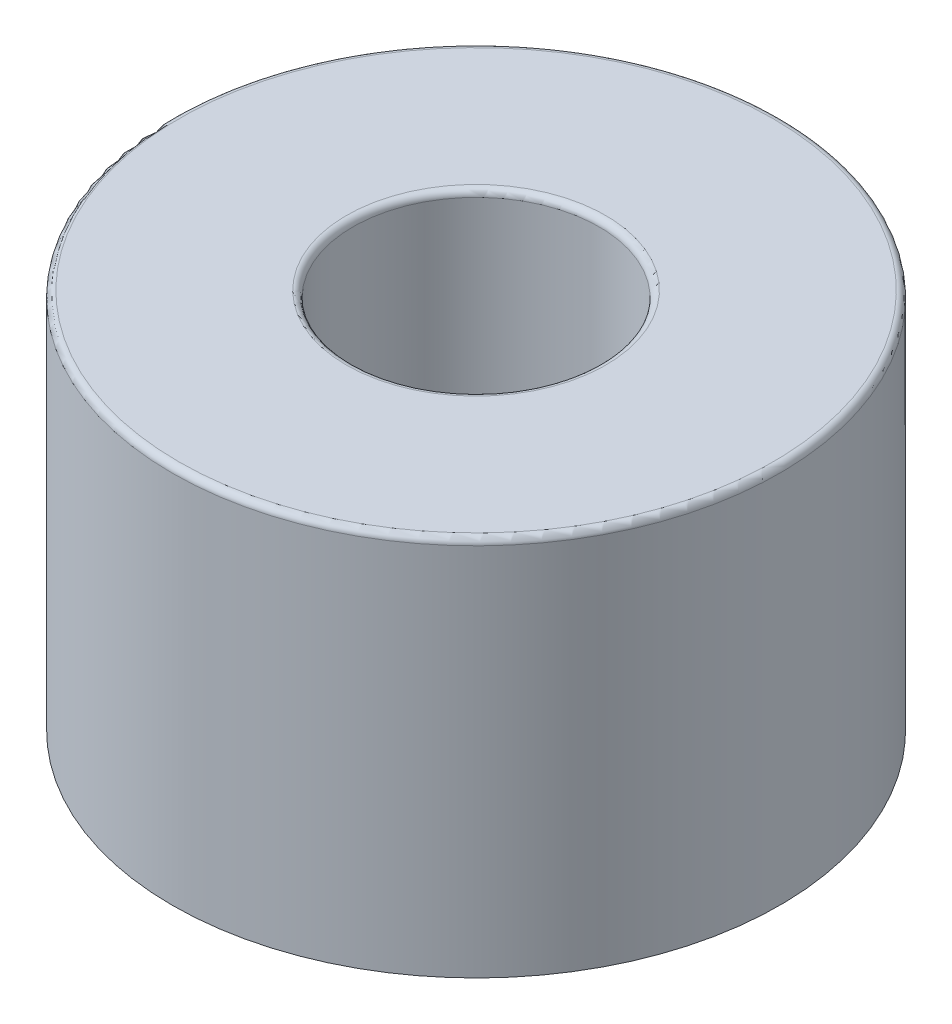
ISO-10303-21;
HEADER;
FILE_DESCRIPTION(('STEP AP214'),'2;1');
FILE_NAME('part.step','',(''),(''),'','','');
FILE_SCHEMA(('AUTOMOTIVE_DESIGN { 1 0 10303 214 1 1 1 1 }'));
ENDSEC;
DATA;
#1=APPLICATION_CONTEXT('core data for automotive mechanical design processes');
#2=APPLICATION_PROTOCOL_DEFINITION('international standard','automotive_design',2000,#1);
#3=PRODUCT_CONTEXT('',#1,'mechanical');
#4=PRODUCT('Part','Part','',(#3));
#5=PRODUCT_RELATED_PRODUCT_CATEGORY('part','',(#4));
#6=PRODUCT_DEFINITION_FORMATION('','',#4);
#7=PRODUCT_DEFINITION_CONTEXT('part definition',#1,'design');
#8=PRODUCT_DEFINITION('design','',#6,#7);
#9=PRODUCT_DEFINITION_SHAPE('','',#8);
#10=(LENGTH_UNIT() NAMED_UNIT(*) SI_UNIT(.MILLI.,.METRE.));
#11=(NAMED_UNIT(*) PLANE_ANGLE_UNIT() SI_UNIT($,.RADIAN.));
#12=(NAMED_UNIT(*) SI_UNIT($,.STERADIAN.) SOLID_ANGLE_UNIT());
#13=UNCERTAINTY_MEASURE_WITH_UNIT(LENGTH_MEASURE(1.E-05),#10,'distance_accuracy_value','');
#14=(GEOMETRIC_REPRESENTATION_CONTEXT(3) GLOBAL_UNCERTAINTY_ASSIGNED_CONTEXT((#13)) GLOBAL_UNIT_ASSIGNED_CONTEXT((#10,
#11,#12)) REPRESENTATION_CONTEXT('',''));
#15=CARTESIAN_POINT('',(0.,0.,0.));
#16=DIRECTION('',(0.,0.,1.));
#17=DIRECTION('',(1.,0.,0.));
#18=AXIS2_PLACEMENT_3D('',#15,#16,#17);
#19=CARTESIAN_POINT('',(0.,14.732,0.));
#20=DIRECTION('',(0.,1.,0.));
#21=DIRECTION('',(0.,0.,1.));
#22=AXIS2_PLACEMENT_3D('',#19,#20,#21);
#23=PLANE('',#22);
#24=CARTESIAN_POINT('',(0.,14.732,0.));
#25=DIRECTION('',(0.,1.,0.));
#26=DIRECTION('',(0.,0.,1.));
#27=AXIS2_PLACEMENT_3D('',#24,#25,#26);
#28=CIRCLE('',#27,5.0165);
#29=CARTESIAN_POINT('',(0.,14.732,5.0165));
#30=VERTEX_POINT('',#29);
#31=EDGE_CURVE('E40',#30,#30,#28,.F.);
#32=ORIENTED_EDGE('',*,*,#31,.T.);
#33=EDGE_LOOP('',(#32));
#34=FACE_BOUND('',#33,.T.);
#35=CARTESIAN_POINT('',(0.,14.732,0.));
#36=DIRECTION('',(0.,1.,0.));
#37=DIRECTION('',(0.,0.,1.));
#38=AXIS2_PLACEMENT_3D('',#35,#36,#37);
#39=CIRCLE('',#38,11.496);
#40=CARTESIAN_POINT('',(0.,14.732,11.496));
#41=VERTEX_POINT('',#40);
#42=EDGE_CURVE('E44',#41,#41,#39,.T.);
#43=ORIENTED_EDGE('',*,*,#42,.T.);
#44=EDGE_LOOP('',(#43));
#45=FACE_BOUND('',#44,.T.);
#46=ADVANCED_FACE('F33',(#34,#45),#23,.T.);
#47=CARTESIAN_POINT('',(0.,0.,0.));
#48=DIRECTION('',(0.,1.,0.));
#49=DIRECTION('',(0.,0.,1.));
#50=AXIS2_PLACEMENT_3D('',#47,#48,#49);
#51=PLANE('',#50);
#52=CARTESIAN_POINT('',(0.,0.,0.));
#53=DIRECTION('',(0.,1.,0.));
#54=DIRECTION('',(0.,0.,1.));
#55=AXIS2_PLACEMENT_3D('',#52,#53,#54);
#56=CIRCLE('',#55,11.75);
#57=CARTESIAN_POINT('',(0.,0.,11.75));
#58=VERTEX_POINT('',#57);
#59=EDGE_CURVE('E53',#58,#58,#56,.T.);
#60=ORIENTED_EDGE('',*,*,#59,.F.);
#61=EDGE_LOOP('',(#60));
#62=FACE_BOUND('',#61,.T.);
#63=CARTESIAN_POINT('',(0.,0.,0.));
#64=DIRECTION('',(0.,1.,0.));
#65=DIRECTION('',(0.,0.,1.));
#66=AXIS2_PLACEMENT_3D('',#63,#64,#65);
#67=CIRCLE('',#66,4.7625);
#68=CARTESIAN_POINT('',(0.,0.,4.7625));
#69=VERTEX_POINT('',#68);
#70=EDGE_CURVE('E56',#69,#69,#67,.T.);
#71=ORIENTED_EDGE('',*,*,#70,.T.);
#72=EDGE_LOOP('',(#71));
#73=FACE_BOUND('',#72,.T.);
#74=ADVANCED_FACE('F60',(#62,#73),#51,.F.);
#75=CARTESIAN_POINT('',(0.,14.732,0.));
#76=DIRECTION('',(0.,-1.,0.));
#77=DIRECTION('',(0.,0.,-1.));
#78=AXIS2_PLACEMENT_3D('',#75,#76,#77);
#79=CYLINDRICAL_SURFACE('',#78,11.75);
#80=CARTESIAN_POINT('',(0.,14.478,0.));
#81=DIRECTION('',(0.,1.,0.));
#82=DIRECTION('',(0.,0.,1.));
#83=AXIS2_PLACEMENT_3D('',#80,#81,#82);
#84=CIRCLE('',#83,11.75);
#85=CARTESIAN_POINT('',(0.,14.478,11.75));
#86=VERTEX_POINT('',#85);
#87=EDGE_CURVE('E10',#86,#86,#84,.F.);
#88=ORIENTED_EDGE('',*,*,#87,.T.);
#89=EDGE_LOOP('',(#88));
#90=FACE_BOUND('',#89,.T.);
#91=ORIENTED_EDGE('',*,*,#59,.T.);
#92=EDGE_LOOP('',(#91));
#93=FACE_BOUND('',#92,.T.);
#94=ADVANCED_FACE('F65',(#90,#93),#79,.T.);
#95=CARTESIAN_POINT('',(0.,14.732,0.));
#96=DIRECTION('',(0.,-1.,0.));
#97=DIRECTION('',(0.,0.,-1.));
#98=AXIS2_PLACEMENT_3D('',#95,#96,#97);
#99=CYLINDRICAL_SURFACE('',#98,4.7625);
#100=CARTESIAN_POINT('',(0.,14.478,0.));
#101=DIRECTION('',(0.,1.,0.));
#102=DIRECTION('',(0.,0.,1.));
#103=AXIS2_PLACEMENT_3D('',#100,#101,#102);
#104=CIRCLE('',#103,4.7625);
#105=CARTESIAN_POINT('',(0.,14.478,4.7625));
#106=VERTEX_POINT('',#105);
#107=EDGE_CURVE('E48',#106,#106,#104,.T.);
#108=ORIENTED_EDGE('',*,*,#107,.T.);
#109=EDGE_LOOP('',(#108));
#110=FACE_BOUND('',#109,.T.);
#111=ORIENTED_EDGE('',*,*,#70,.F.);
#112=EDGE_LOOP('',(#111));
#113=FACE_BOUND('',#112,.T.);
#114=ADVANCED_FACE('F62',(#110,#113),#99,.F.);
#115=CARTESIAN_POINT('',(0.,14.478,0.));
#116=DIRECTION('',(0.,1.,0.));
#117=DIRECTION('',(0.,0.,1.));
#118=AXIS2_PLACEMENT_3D('',#115,#116,#117);
#119=TOROIDAL_SURFACE('',#118,5.0165,0.254);
#120=ORIENTED_EDGE('',*,*,#31,.F.);
#121=EDGE_LOOP('',(#120));
#122=FACE_BOUND('',#121,.T.);
#123=ORIENTED_EDGE('',*,*,#107,.F.);
#124=EDGE_LOOP('',(#123));
#125=FACE_BOUND('',#124,.T.);
#126=ADVANCED_FACE('F64',(#122,#125),#119,.T.);
#127=CARTESIAN_POINT('',(0.,14.478,0.));
#128=DIRECTION('',(0.,1.,0.));
#129=DIRECTION('',(0.,0.,1.));
#130=AXIS2_PLACEMENT_3D('',#127,#128,#129);
#131=TOROIDAL_SURFACE('',#130,11.496,0.254);
#132=ORIENTED_EDGE('',*,*,#87,.F.);
#133=EDGE_LOOP('',(#132));
#134=FACE_BOUND('',#133,.T.);
#135=ORIENTED_EDGE('',*,*,#42,.F.);
#136=EDGE_LOOP('',(#135));
#137=FACE_BOUND('',#136,.T.);
#138=ADVANCED_FACE('F35',(#134,#137),#131,.T.);
#139=CLOSED_SHELL('',(#46,#74,#94,#114,#126,#138));
#140=MANIFOLD_SOLID_BREP('B2',#139);
#141=ADVANCED_BREP_SHAPE_REPRESENTATION('',(#18,#140),#14);
#142=SHAPE_DEFINITION_REPRESENTATION(#9,#141);
ENDSEC;
END-ISO-10303-21;
